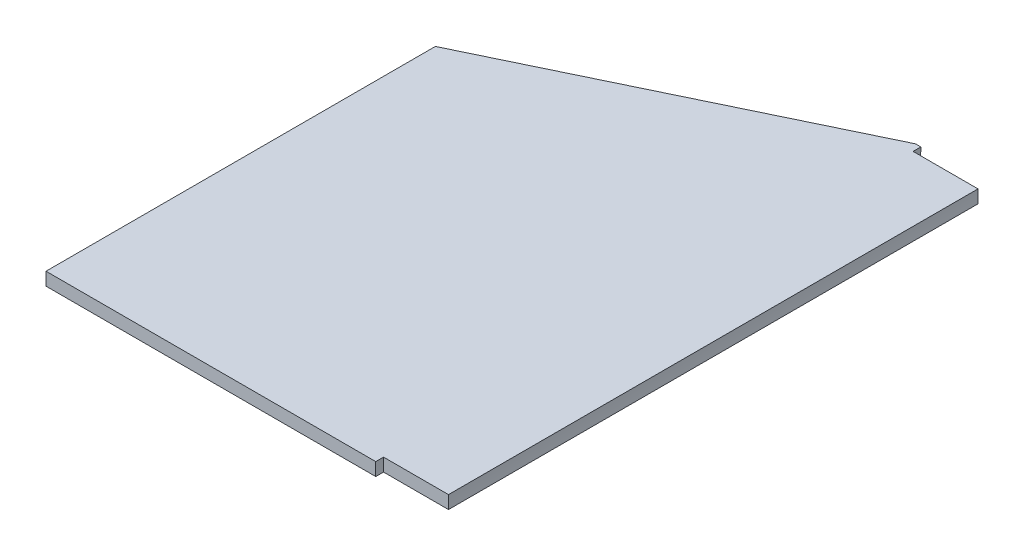
ISO-10303-21;
HEADER;
FILE_DESCRIPTION(('STEP AP214'),'2;1');
FILE_NAME('part.step','',(''),(''),'','','');
FILE_SCHEMA(('AUTOMOTIVE_DESIGN { 1 0 10303 214 1 1 1 1 }'));
ENDSEC;
DATA;
#1=APPLICATION_CONTEXT('core data for automotive mechanical design processes');
#2=APPLICATION_PROTOCOL_DEFINITION('international standard','automotive_design',2000,#1);
#3=PRODUCT_CONTEXT('',#1,'mechanical');
#4=PRODUCT('Part','Part','',(#3));
#5=PRODUCT_RELATED_PRODUCT_CATEGORY('part','',(#4));
#6=PRODUCT_DEFINITION_FORMATION('','',#4);
#7=PRODUCT_DEFINITION_CONTEXT('part definition',#1,'design');
#8=PRODUCT_DEFINITION('design','',#6,#7);
#9=PRODUCT_DEFINITION_SHAPE('','',#8);
#10=(LENGTH_UNIT() NAMED_UNIT(*) SI_UNIT(.MILLI.,.METRE.));
#11=(NAMED_UNIT(*) PLANE_ANGLE_UNIT() SI_UNIT($,.RADIAN.));
#12=(NAMED_UNIT(*) SI_UNIT($,.STERADIAN.) SOLID_ANGLE_UNIT());
#13=UNCERTAINTY_MEASURE_WITH_UNIT(LENGTH_MEASURE(1.E-05),#10,'distance_accuracy_value','');
#14=(GEOMETRIC_REPRESENTATION_CONTEXT(3) GLOBAL_UNCERTAINTY_ASSIGNED_CONTEXT((#13)) GLOBAL_UNIT_ASSIGNED_CONTEXT((#10,
#11,#12)) REPRESENTATION_CONTEXT('',''));
#15=CARTESIAN_POINT('',(0.,0.,0.));
#16=DIRECTION('',(0.,0.,1.));
#17=DIRECTION('',(1.,0.,0.));
#18=AXIS2_PLACEMENT_3D('',#15,#16,#17);
#19=CARTESIAN_POINT('',(78.2,0.,0.));
#20=DIRECTION('',(0.,0.,-1.));
#21=DIRECTION('',(-1.,0.,0.));
#22=AXIS2_PLACEMENT_3D('',#19,#20,#21);
#23=CYLINDRICAL_SURFACE('',#22,51.2);
#24=CARTESIAN_POINT('',(78.2,0.,-3.));
#25=DIRECTION('',(0.,0.,1.));
#26=DIRECTION('',(1.,0.,0.));
#27=AXIS2_PLACEMENT_3D('',#24,#25,#26);
#28=CIRCLE('',#27,51.2);
#29=CARTESIAN_POINT('',(27.0610715794709,-2.5,-3.));
#30=VERTEX_POINT('',#29);
#31=CARTESIAN_POINT('',(27.0610715794709,2.5,-3.));
#32=VERTEX_POINT('',#31);
#33=EDGE_CURVE('E55',#30,#32,#28,.F.);
#34=ORIENTED_EDGE('',*,*,#33,.F.);
#35=DIRECTION('',(0.,0.,-1.));
#36=VECTOR('',#35,1.);
#37=CARTESIAN_POINT('',(27.0610715794709,-2.5,0.));
#38=LINE('',#37,#36);
#39=CARTESIAN_POINT('',(27.0610715794709,-2.5,-207.));
#40=VERTEX_POINT('',#39);
#41=EDGE_CURVE('E165',#40,#30,#38,.F.);
#42=ORIENTED_EDGE('',*,*,#41,.F.);
#43=CARTESIAN_POINT('',(78.2,0.,-207.));
#44=DIRECTION('',(0.,0.,-1.));
#45=DIRECTION('',(-1.,0.,0.));
#46=AXIS2_PLACEMENT_3D('',#43,#44,#45);
#47=CIRCLE('',#46,51.2);
#48=CARTESIAN_POINT('',(27.0610715794709,2.5,-207.));
#49=VERTEX_POINT('',#48);
#50=EDGE_CURVE('E158',#49,#40,#47,.F.);
#51=ORIENTED_EDGE('',*,*,#50,.F.);
#52=DIRECTION('',(0.,0.,-1.));
#53=VECTOR('',#52,1.);
#54=CARTESIAN_POINT('',(27.0610715794709,2.5,0.));
#55=LINE('',#54,#53);
#56=EDGE_CURVE('E152',#49,#32,#55,.F.);
#57=ORIENTED_EDGE('',*,*,#56,.T.);
#58=EDGE_LOOP('',(#34,#42,#51,#57));
#59=FACE_BOUND('',#58,.T.);
#60=ADVANCED_FACE('F40',(#59),#23,.F.);
#61=CARTESIAN_POINT('',(0.,-2.5,-210.));
#62=DIRECTION('',(-0.432731067584771,0.,-0.901523057468274));
#63=DIRECTION('',(-0.901523057468274,0.,0.432731067584771));
#64=AXIS2_PLACEMENT_3D('',#61,#62,#63);
#65=PLANE('',#64);
#66=DIRECTION('',(0.,1.,0.));
#67=VECTOR('',#66,1.);
#68=CARTESIAN_POINT('',(-125.,-2.5,-150.));
#69=LINE('',#68,#67);
#70=CARTESIAN_POINT('',(-125.,-2.5,-150.));
#71=VERTEX_POINT('',#70);
#72=CARTESIAN_POINT('',(-125.,2.5,-150.));
#73=VERTEX_POINT('',#72);
#74=EDGE_CURVE('E148',#71,#73,#69,.T.);
#75=ORIENTED_EDGE('',*,*,#74,.T.);
#76=DIRECTION('',(-0.901523057468274,0.,0.432731067584771));
#77=VECTOR('',#76,1.);
#78=CARTESIAN_POINT('',(0.,2.5,-210.));
#79=LINE('',#78,#77);
#80=CARTESIAN_POINT('',(0.,2.5,-210.));
#81=VERTEX_POINT('',#80);
#82=EDGE_CURVE('E136',#81,#73,#79,.T.);
#83=ORIENTED_EDGE('',*,*,#82,.F.);
#84=DIRECTION('',(0.,1.,0.));
#85=VECTOR('',#84,1.);
#86=CARTESIAN_POINT('',(0.,-2.5,-210.));
#87=LINE('',#86,#85);
#88=CARTESIAN_POINT('',(0.,-2.5,-210.));
#89=VERTEX_POINT('',#88);
#90=EDGE_CURVE('E149',#89,#81,#87,.T.);
#91=ORIENTED_EDGE('',*,*,#90,.F.);
#92=DIRECTION('',(-0.901523057468274,0.,0.432731067584771));
#93=VECTOR('',#92,1.);
#94=CARTESIAN_POINT('',(0.,-2.5,-210.));
#95=LINE('',#94,#93);
#96=EDGE_CURVE('E134',#89,#71,#95,.T.);
#97=ORIENTED_EDGE('',*,*,#96,.T.);
#98=EDGE_LOOP('',(#75,#83,#91,#97));
#99=FACE_BOUND('',#98,.T.);
#100=ADVANCED_FACE('F42',(#99),#65,.T.);
#101=CARTESIAN_POINT('',(0.,-2.5,-210.));
#102=DIRECTION('',(0.,0.,-1.));
#103=DIRECTION('',(-1.,0.,0.));
#104=AXIS2_PLACEMENT_3D('',#101,#102,#103);
#105=PLANE('',#104);
#106=CARTESIAN_POINT('',(78.2,0.,-210.));
#107=DIRECTION('',(0.,0.,-1.));
#108=DIRECTION('',(-1.,0.,0.));
#109=AXIS2_PLACEMENT_3D('',#106,#107,#108);
#110=CIRCLE('',#109,76.2);
#111=CARTESIAN_POINT('',(2.04102154046446,-2.5,-210.));
#112=VERTEX_POINT('',#111);
#113=CARTESIAN_POINT('',(2.04102154046446,2.5,-210.));
#114=VERTEX_POINT('',#113);
#115=EDGE_CURVE('E193',#112,#114,#110,.T.);
#116=ORIENTED_EDGE('',*,*,#115,.F.);
#117=DIRECTION('',(-1.,0.,0.));
#118=VECTOR('',#117,1.);
#119=CARTESIAN_POINT('',(0.,-2.5,-210.));
#120=LINE('',#119,#118);
#121=EDGE_CURVE('E146',#112,#89,#120,.T.);
#122=ORIENTED_EDGE('',*,*,#121,.T.);
#123=ORIENTED_EDGE('',*,*,#90,.T.);
#124=DIRECTION('',(-1.,0.,0.));
#125=VECTOR('',#124,1.);
#126=CARTESIAN_POINT('',(0.,2.5,-210.));
#127=LINE('',#126,#125);
#128=EDGE_CURVE('E132',#114,#81,#127,.T.);
#129=ORIENTED_EDGE('',*,*,#128,.F.);
#130=EDGE_LOOP('',(#116,#122,#123,#129));
#131=FACE_BOUND('',#130,.T.);
#132=ADVANCED_FACE('F201',(#131),#105,.T.);
#133=CARTESIAN_POINT('',(0.,-2.5,0.));
#134=DIRECTION('',(0.,0.,1.));
#135=DIRECTION('',(1.,0.,0.));
#136=AXIS2_PLACEMENT_3D('',#133,#134,#135);
#137=PLANE('',#136);
#138=CARTESIAN_POINT('',(78.2,0.,0.));
#139=DIRECTION('',(0.,0.,1.));
#140=DIRECTION('',(1.,0.,0.));
#141=AXIS2_PLACEMENT_3D('',#138,#139,#140);
#142=CIRCLE('',#141,76.2);
#143=CARTESIAN_POINT('',(2.04102154046441,2.5,0.));
#144=VERTEX_POINT('',#143);
#145=CARTESIAN_POINT('',(2.04102154046441,-2.5,0.));
#146=VERTEX_POINT('',#145);
#147=EDGE_CURVE('E113',#144,#146,#142,.T.);
#148=ORIENTED_EDGE('',*,*,#147,.F.);
#149=DIRECTION('',(1.,0.,0.));
#150=VECTOR('',#149,1.);
#151=CARTESIAN_POINT('',(-125.,2.5,0.));
#152=LINE('',#151,#150);
#153=CARTESIAN_POINT('',(-125.,2.5,0.));
#154=VERTEX_POINT('',#153);
#155=EDGE_CURVE('E123',#154,#144,#152,.T.);
#156=ORIENTED_EDGE('',*,*,#155,.F.);
#157=DIRECTION('',(0.,1.,0.));
#158=VECTOR('',#157,1.);
#159=CARTESIAN_POINT('',(-125.,-2.5,0.));
#160=LINE('',#159,#158);
#161=CARTESIAN_POINT('',(-125.,-2.5,0.));
#162=VERTEX_POINT('',#161);
#163=EDGE_CURVE('E153',#162,#154,#160,.T.);
#164=ORIENTED_EDGE('',*,*,#163,.F.);
#165=DIRECTION('',(1.,0.,0.));
#166=VECTOR('',#165,1.);
#167=CARTESIAN_POINT('',(-125.,-2.5,0.));
#168=LINE('',#167,#166);
#169=EDGE_CURVE('E125',#162,#146,#168,.T.);
#170=ORIENTED_EDGE('',*,*,#169,.T.);
#171=EDGE_LOOP('',(#148,#156,#164,#170));
#172=FACE_BOUND('',#171,.T.);
#173=ADVANCED_FACE('F122',(#172),#137,.T.);
#174=CARTESIAN_POINT('',(-125.,-2.5,-150.));
#175=DIRECTION('',(-1.,0.,0.));
#176=DIRECTION('',(0.,0.,1.));
#177=AXIS2_PLACEMENT_3D('',#174,#175,#176);
#178=PLANE('',#177);
#179=ORIENTED_EDGE('',*,*,#163,.T.);
#180=DIRECTION('',(0.,0.,1.));
#181=VECTOR('',#180,1.);
#182=CARTESIAN_POINT('',(-125.,2.5,-150.));
#183=LINE('',#182,#181);
#184=EDGE_CURVE('E131',#73,#154,#183,.T.);
#185=ORIENTED_EDGE('',*,*,#184,.F.);
#186=ORIENTED_EDGE('',*,*,#74,.F.);
#187=DIRECTION('',(0.,0.,1.));
#188=VECTOR('',#187,1.);
#189=CARTESIAN_POINT('',(-125.,-2.5,-150.));
#190=LINE('',#189,#188);
#191=EDGE_CURVE('E142',#71,#162,#190,.T.);
#192=ORIENTED_EDGE('',*,*,#191,.T.);
#193=EDGE_LOOP('',(#179,#185,#186,#192));
#194=FACE_BOUND('',#193,.T.);
#195=ADVANCED_FACE('F190',(#194),#178,.T.);
#196=CARTESIAN_POINT('',(0.,-2.5,0.));
#197=DIRECTION('',(0.,1.,0.));
#198=DIRECTION('',(0.,0.,1.));
#199=AXIS2_PLACEMENT_3D('',#196,#197,#198);
#200=PLANE('',#199);
#201=DIRECTION('',(1.,0.,0.));
#202=VECTOR('',#201,1.);
#203=CARTESIAN_POINT('',(0.,-2.5,-3.));
#204=LINE('',#203,#202);
#205=CARTESIAN_POINT('',(2.04102154046441,-2.5,-3.));
#206=VERTEX_POINT('',#205);
#207=EDGE_CURVE('E192',#206,#30,#204,.T.);
#208=ORIENTED_EDGE('',*,*,#207,.F.);
#209=DIRECTION('',(0.,0.,1.));
#210=VECTOR('',#209,1.);
#211=CARTESIAN_POINT('',(2.04102154046441,-2.5,-3.));
#212=LINE('',#211,#210);
#213=EDGE_CURVE('E191',#206,#146,#212,.T.);
#214=ORIENTED_EDGE('',*,*,#213,.T.);
#215=ORIENTED_EDGE('',*,*,#169,.F.);
#216=ORIENTED_EDGE('',*,*,#191,.F.);
#217=ORIENTED_EDGE('',*,*,#96,.F.);
#218=ORIENTED_EDGE('',*,*,#121,.F.);
#219=DIRECTION('',(0.,0.,-1.));
#220=VECTOR('',#219,1.);
#221=CARTESIAN_POINT('',(2.04102154046446,-2.5,-207.));
#222=LINE('',#221,#220);
#223=CARTESIAN_POINT('',(2.04102154046446,-2.5,-207.));
#224=VERTEX_POINT('',#223);
#225=EDGE_CURVE('E175',#112,#224,#222,.F.);
#226=ORIENTED_EDGE('',*,*,#225,.T.);
#227=DIRECTION('',(-1.,0.,0.));
#228=VECTOR('',#227,1.);
#229=CARTESIAN_POINT('',(0.,-2.5,-207.));
#230=LINE('',#229,#228);
#231=EDGE_CURVE('E168',#40,#224,#230,.T.);
#232=ORIENTED_EDGE('',*,*,#231,.F.);
#233=ORIENTED_EDGE('',*,*,#41,.T.);
#234=EDGE_LOOP('',(#208,#214,#215,#216,#217,#218,#226,#232,#233));
#235=FACE_BOUND('',#234,.T.);
#236=ADVANCED_FACE('F173',(#235),#200,.F.);
#237=CARTESIAN_POINT('',(0.,2.5,0.));
#238=DIRECTION('',(0.,1.,0.));
#239=DIRECTION('',(0.,0.,1.));
#240=AXIS2_PLACEMENT_3D('',#237,#238,#239);
#241=PLANE('',#240);
#242=DIRECTION('',(0.,0.,1.));
#243=VECTOR('',#242,1.);
#244=CARTESIAN_POINT('',(2.04102154046441,2.5,-3.));
#245=LINE('',#244,#243);
#246=CARTESIAN_POINT('',(2.04102154046441,2.5,-3.));
#247=VERTEX_POINT('',#246);
#248=EDGE_CURVE('E11',#247,#144,#245,.T.);
#249=ORIENTED_EDGE('',*,*,#248,.F.);
#250=DIRECTION('',(1.,0.,0.));
#251=VECTOR('',#250,1.);
#252=CARTESIAN_POINT('',(0.,2.5,-3.));
#253=LINE('',#252,#251);
#254=EDGE_CURVE('E48',#247,#32,#253,.T.);
#255=ORIENTED_EDGE('',*,*,#254,.T.);
#256=ORIENTED_EDGE('',*,*,#56,.F.);
#257=DIRECTION('',(-1.,0.,0.));
#258=VECTOR('',#257,1.);
#259=CARTESIAN_POINT('',(0.,2.5,-207.));
#260=LINE('',#259,#258);
#261=CARTESIAN_POINT('',(2.04102154046446,2.5,-207.));
#262=VERTEX_POINT('',#261);
#263=EDGE_CURVE('E63',#49,#262,#260,.T.);
#264=ORIENTED_EDGE('',*,*,#263,.T.);
#265=DIRECTION('',(0.,0.,-1.));
#266=VECTOR('',#265,1.);
#267=CARTESIAN_POINT('',(2.04102154046446,2.5,-207.));
#268=LINE('',#267,#266);
#269=EDGE_CURVE('E160',#114,#262,#268,.F.);
#270=ORIENTED_EDGE('',*,*,#269,.F.);
#271=ORIENTED_EDGE('',*,*,#128,.T.);
#272=ORIENTED_EDGE('',*,*,#82,.T.);
#273=ORIENTED_EDGE('',*,*,#184,.T.);
#274=ORIENTED_EDGE('',*,*,#155,.T.);
#275=EDGE_LOOP('',(#249,#255,#256,#264,#270,#271,#272,#273,#274));
#276=FACE_BOUND('',#275,.T.);
#277=ADVANCED_FACE('F128',(#276),#241,.T.);
#278=CARTESIAN_POINT('',(78.2,0.,-207.));
#279=DIRECTION('',(0.,0.,-1.));
#280=DIRECTION('',(-1.,0.,0.));
#281=AXIS2_PLACEMENT_3D('',#278,#279,#280);
#282=CYLINDRICAL_SURFACE('',#281,76.2);
#283=ORIENTED_EDGE('',*,*,#115,.T.);
#284=ORIENTED_EDGE('',*,*,#269,.T.);
#285=CARTESIAN_POINT('',(78.2,0.,-207.));
#286=DIRECTION('',(0.,0.,-1.));
#287=DIRECTION('',(-1.,0.,0.));
#288=AXIS2_PLACEMENT_3D('',#285,#286,#287);
#289=CIRCLE('',#288,76.2);
#290=EDGE_CURVE('E178',#224,#262,#289,.T.);
#291=ORIENTED_EDGE('',*,*,#290,.F.);
#292=ORIENTED_EDGE('',*,*,#225,.F.);
#293=EDGE_LOOP('',(#283,#284,#291,#292));
#294=FACE_BOUND('',#293,.T.);
#295=ADVANCED_FACE('F202',(#294),#282,.F.);
#296=CARTESIAN_POINT('',(78.2,0.,-207.));
#297=DIRECTION('',(0.,0.,-1.));
#298=DIRECTION('',(-1.,0.,0.));
#299=AXIS2_PLACEMENT_3D('',#296,#297,#298);
#300=PLANE('',#299);
#301=ORIENTED_EDGE('',*,*,#231,.T.);
#302=ORIENTED_EDGE('',*,*,#290,.T.);
#303=ORIENTED_EDGE('',*,*,#263,.F.);
#304=ORIENTED_EDGE('',*,*,#50,.T.);
#305=EDGE_LOOP('',(#301,#302,#303,#304));
#306=FACE_BOUND('',#305,.T.);
#307=ADVANCED_FACE('F167',(#306),#300,.T.);
#308=CARTESIAN_POINT('',(78.2,0.,-3.));
#309=DIRECTION('',(0.,0.,1.));
#310=DIRECTION('',(1.,0.,0.));
#311=AXIS2_PLACEMENT_3D('',#308,#309,#310);
#312=CYLINDRICAL_SURFACE('',#311,76.2);
#313=CARTESIAN_POINT('',(78.2,0.,-3.));
#314=DIRECTION('',(0.,0.,1.));
#315=DIRECTION('',(1.,0.,0.));
#316=AXIS2_PLACEMENT_3D('',#313,#314,#315);
#317=CIRCLE('',#316,76.2);
#318=EDGE_CURVE('E116',#247,#206,#317,.T.);
#319=ORIENTED_EDGE('',*,*,#318,.F.);
#320=ORIENTED_EDGE('',*,*,#248,.T.);
#321=ORIENTED_EDGE('',*,*,#147,.T.);
#322=ORIENTED_EDGE('',*,*,#213,.F.);
#323=EDGE_LOOP('',(#319,#320,#321,#322));
#324=FACE_BOUND('',#323,.T.);
#325=ADVANCED_FACE('F112',(#324),#312,.F.);
#326=CARTESIAN_POINT('',(78.2,0.,-3.));
#327=DIRECTION('',(0.,0.,1.));
#328=DIRECTION('',(1.,0.,0.));
#329=AXIS2_PLACEMENT_3D('',#326,#327,#328);
#330=PLANE('',#329);
#331=ORIENTED_EDGE('',*,*,#207,.T.);
#332=ORIENTED_EDGE('',*,*,#33,.T.);
#333=ORIENTED_EDGE('',*,*,#254,.F.);
#334=ORIENTED_EDGE('',*,*,#318,.T.);
#335=EDGE_LOOP('',(#331,#332,#333,#334));
#336=FACE_BOUND('',#335,.T.);
#337=ADVANCED_FACE('F251',(#336),#330,.T.);
#338=CLOSED_SHELL('',(#60,#100,#132,#173,#195,#236,#277,#295,#307,#325,#337));
#339=MANIFOLD_SOLID_BREP('B2',#338);
#340=ADVANCED_BREP_SHAPE_REPRESENTATION('',(#18,#339),#14);
#341=SHAPE_DEFINITION_REPRESENTATION(#9,#340);
ENDSEC;
END-ISO-10303-21;
